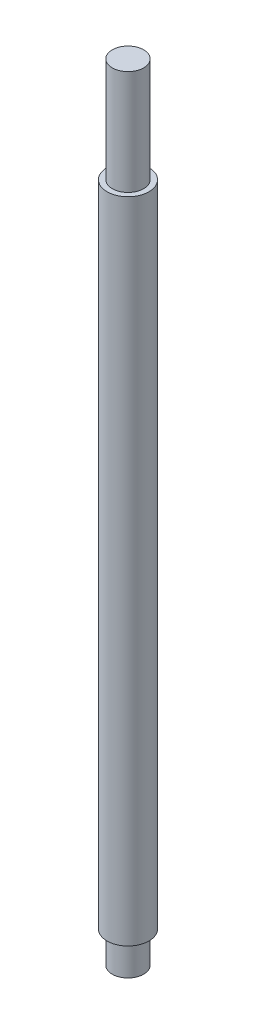
ISO-10303-21;
HEADER;
FILE_DESCRIPTION(('STEP AP214'),'2;1');
FILE_NAME('part.step','',(''),(''),'','','');
FILE_SCHEMA(('AUTOMOTIVE_DESIGN { 1 0 10303 214 1 1 1 1 }'));
ENDSEC;
DATA;
#1=APPLICATION_CONTEXT('core data for automotive mechanical design processes');
#2=APPLICATION_PROTOCOL_DEFINITION('international standard','automotive_design',2000,#1);
#3=PRODUCT_CONTEXT('',#1,'mechanical');
#4=PRODUCT('Part','Part','',(#3));
#5=PRODUCT_RELATED_PRODUCT_CATEGORY('part','',(#4));
#6=PRODUCT_DEFINITION_FORMATION('','',#4);
#7=PRODUCT_DEFINITION_CONTEXT('part definition',#1,'design');
#8=PRODUCT_DEFINITION('design','',#6,#7);
#9=PRODUCT_DEFINITION_SHAPE('','',#8);
#10=(LENGTH_UNIT() NAMED_UNIT(*) SI_UNIT(.MILLI.,.METRE.));
#11=(NAMED_UNIT(*) PLANE_ANGLE_UNIT() SI_UNIT($,.RADIAN.));
#12=(NAMED_UNIT(*) SI_UNIT($,.STERADIAN.) SOLID_ANGLE_UNIT());
#13=UNCERTAINTY_MEASURE_WITH_UNIT(LENGTH_MEASURE(1.E-05),#10,'distance_accuracy_value','');
#14=(GEOMETRIC_REPRESENTATION_CONTEXT(3) GLOBAL_UNCERTAINTY_ASSIGNED_CONTEXT((#13)) GLOBAL_UNIT_ASSIGNED_CONTEXT((#10,
#11,#12)) REPRESENTATION_CONTEXT('',''));
#15=CARTESIAN_POINT('',(0.,0.,0.));
#16=DIRECTION('',(0.,0.,1.));
#17=DIRECTION('',(1.,0.,0.));
#18=AXIS2_PLACEMENT_3D('',#15,#16,#17);
#19=CARTESIAN_POINT('',(0.,0.,0.));
#20=DIRECTION('',(0.,1.,0.));
#21=DIRECTION('',(0.,0.,1.));
#22=AXIS2_PLACEMENT_3D('',#19,#20,#21);
#23=PLANE('',#22);
#24=CARTESIAN_POINT('',(0.,0.,0.));
#25=DIRECTION('',(0.,1.,0.));
#26=DIRECTION('',(0.,0.,1.));
#27=AXIS2_PLACEMENT_3D('',#24,#25,#26);
#28=CIRCLE('',#27,2.);
#29=CARTESIAN_POINT('',(0.,0.,2.));
#30=VERTEX_POINT('',#29);
#31=EDGE_CURVE('E42',#30,#30,#28,.T.);
#32=ORIENTED_EDGE('',*,*,#31,.F.);
#33=EDGE_LOOP('',(#32));
#34=FACE_BOUND('',#33,.T.);
#35=CARTESIAN_POINT('',(0.,0.,0.));
#36=DIRECTION('',(0.,1.,0.));
#37=DIRECTION('',(0.,0.,1.));
#38=AXIS2_PLACEMENT_3D('',#35,#36,#37);
#39=CIRCLE('',#38,1.5);
#40=CARTESIAN_POINT('',(0.,0.,1.5));
#41=VERTEX_POINT('',#40);
#42=EDGE_CURVE('E10',#41,#41,#39,.F.);
#43=ORIENTED_EDGE('',*,*,#42,.F.);
#44=EDGE_LOOP('',(#43));
#45=FACE_BOUND('',#44,.T.);
#46=ADVANCED_FACE('F31',(#34,#45),#23,.F.);
#47=CARTESIAN_POINT('',(0.,62.,0.));
#48=DIRECTION('',(0.,1.,0.));
#49=DIRECTION('',(0.,0.,1.));
#50=AXIS2_PLACEMENT_3D('',#47,#48,#49);
#51=PLANE('',#50);
#52=CARTESIAN_POINT('',(0.,62.,0.));
#53=DIRECTION('',(0.,1.,0.));
#54=DIRECTION('',(0.,0.,1.));
#55=AXIS2_PLACEMENT_3D('',#52,#53,#54);
#56=CIRCLE('',#55,2.);
#57=CARTESIAN_POINT('',(0.,62.,2.));
#58=VERTEX_POINT('',#57);
#59=EDGE_CURVE('E38',#58,#58,#56,.T.);
#60=ORIENTED_EDGE('',*,*,#59,.T.);
#61=EDGE_LOOP('',(#60));
#62=FACE_BOUND('',#61,.T.);
#63=CARTESIAN_POINT('',(0.,62.,0.));
#64=DIRECTION('',(0.,1.,0.));
#65=DIRECTION('',(0.,0.,1.));
#66=AXIS2_PLACEMENT_3D('',#63,#64,#65);
#67=CIRCLE('',#66,1.5);
#68=CARTESIAN_POINT('',(0.,62.,1.5));
#69=VERTEX_POINT('',#68);
#70=EDGE_CURVE('E49',#69,#69,#67,.T.);
#71=ORIENTED_EDGE('',*,*,#70,.F.);
#72=EDGE_LOOP('',(#71));
#73=FACE_BOUND('',#72,.T.);
#74=ADVANCED_FACE('F73',(#62,#73),#51,.T.);
#75=CARTESIAN_POINT('',(0.,62.,0.));
#76=DIRECTION('',(0.,-1.,0.));
#77=DIRECTION('',(0.,0.,-1.));
#78=AXIS2_PLACEMENT_3D('',#75,#76,#77);
#79=CYLINDRICAL_SURFACE('',#78,2.);
#80=ORIENTED_EDGE('',*,*,#59,.F.);
#81=EDGE_LOOP('',(#80));
#82=FACE_BOUND('',#81,.T.);
#83=ORIENTED_EDGE('',*,*,#31,.T.);
#84=EDGE_LOOP('',(#83));
#85=FACE_BOUND('',#84,.T.);
#86=ADVANCED_FACE('F33',(#82,#85),#79,.T.);
#87=CARTESIAN_POINT('',(0.,72.,0.));
#88=DIRECTION('',(0.,-1.,0.));
#89=DIRECTION('',(0.,0.,-1.));
#90=AXIS2_PLACEMENT_3D('',#87,#88,#89);
#91=CYLINDRICAL_SURFACE('',#90,1.5);
#92=CARTESIAN_POINT('',(0.,72.,0.));
#93=DIRECTION('',(0.,1.,0.));
#94=DIRECTION('',(0.,0.,1.));
#95=AXIS2_PLACEMENT_3D('',#92,#93,#94);
#96=CIRCLE('',#95,1.5);
#97=CARTESIAN_POINT('',(0.,72.,1.5));
#98=VERTEX_POINT('',#97);
#99=EDGE_CURVE('E47',#98,#98,#96,.T.);
#100=ORIENTED_EDGE('',*,*,#99,.F.);
#101=EDGE_LOOP('',(#100));
#102=FACE_BOUND('',#101,.T.);
#103=ORIENTED_EDGE('',*,*,#70,.T.);
#104=EDGE_LOOP('',(#103));
#105=FACE_BOUND('',#104,.T.);
#106=ADVANCED_FACE('F69',(#102,#105),#91,.T.);
#107=CARTESIAN_POINT('',(0.,72.,0.));
#108=DIRECTION('',(0.,1.,0.));
#109=DIRECTION('',(0.,0.,1.));
#110=AXIS2_PLACEMENT_3D('',#107,#108,#109);
#111=PLANE('',#110);
#112=ORIENTED_EDGE('',*,*,#99,.T.);
#113=EDGE_LOOP('',(#112));
#114=FACE_BOUND('',#113,.T.);
#115=ADVANCED_FACE('F62',(#114),#111,.T.);
#116=CARTESIAN_POINT('',(0.,-3.,0.));
#117=DIRECTION('',(0.,1.,0.));
#118=DIRECTION('',(0.,0.,1.));
#119=AXIS2_PLACEMENT_3D('',#116,#117,#118);
#120=CYLINDRICAL_SURFACE('',#119,1.5);
#121=CARTESIAN_POINT('',(0.,-3.,0.));
#122=DIRECTION('',(0.,-1.,0.));
#123=DIRECTION('',(0.,0.,-1.));
#124=AXIS2_PLACEMENT_3D('',#121,#122,#123);
#125=CIRCLE('',#124,1.5);
#126=CARTESIAN_POINT('',(0.,-3.,-1.5));
#127=VERTEX_POINT('',#126);
#128=EDGE_CURVE('E52',#127,#127,#125,.T.);
#129=ORIENTED_EDGE('',*,*,#128,.F.);
#130=EDGE_LOOP('',(#129));
#131=FACE_BOUND('',#130,.T.);
#132=ORIENTED_EDGE('',*,*,#42,.T.);
#133=EDGE_LOOP('',(#132));
#134=FACE_BOUND('',#133,.T.);
#135=ADVANCED_FACE('F60',(#131,#134),#120,.T.);
#136=CARTESIAN_POINT('',(0.,-3.,0.));
#137=DIRECTION('',(0.,-1.,0.));
#138=DIRECTION('',(0.,0.,-1.));
#139=AXIS2_PLACEMENT_3D('',#136,#137,#138);
#140=PLANE('',#139);
#141=ORIENTED_EDGE('',*,*,#128,.T.);
#142=EDGE_LOOP('',(#141));
#143=FACE_BOUND('',#142,.T.);
#144=ADVANCED_FACE('F58',(#143),#140,.T.);
#145=CLOSED_SHELL('',(#46,#74,#86,#106,#115,#135,#144));
#146=MANIFOLD_SOLID_BREP('B2',#145);
#147=ADVANCED_BREP_SHAPE_REPRESENTATION('',(#18,#146),#14);
#148=SHAPE_DEFINITION_REPRESENTATION(#9,#147);
ENDSEC;
END-ISO-10303-21;
